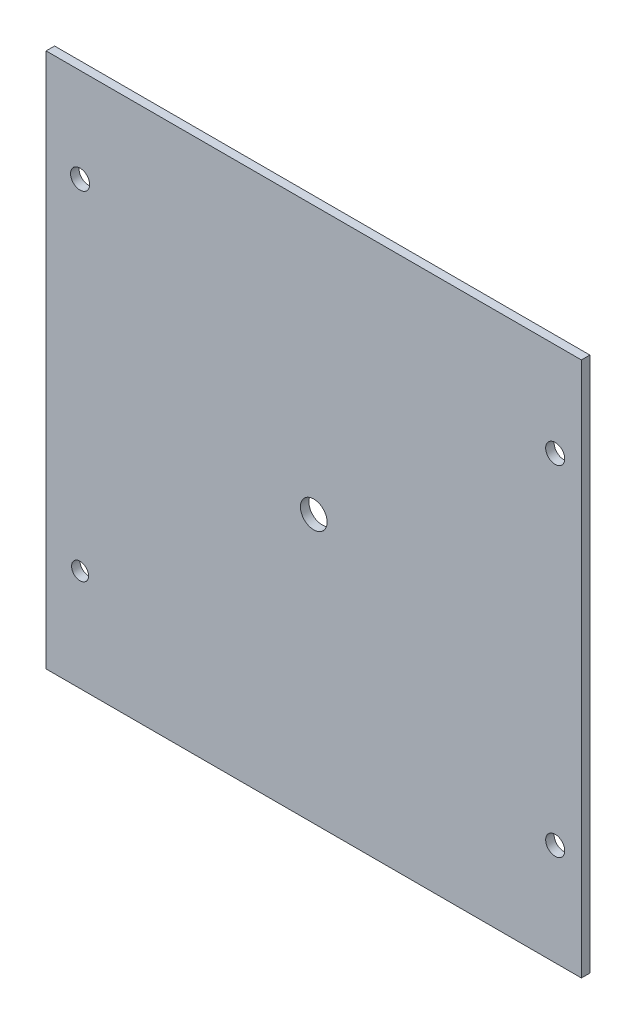
ISO-10303-21;
HEADER;
FILE_DESCRIPTION(('STEP AP214'),'2;1');
FILE_NAME('part.step','',(''),(''),'','','');
FILE_SCHEMA(('AUTOMOTIVE_DESIGN { 1 0 10303 214 1 1 1 1 }'));
ENDSEC;
DATA;
#1=APPLICATION_CONTEXT('core data for automotive mechanical design processes');
#2=APPLICATION_PROTOCOL_DEFINITION('international standard','automotive_design',2000,#1);
#3=PRODUCT_CONTEXT('',#1,'mechanical');
#4=PRODUCT('Part','Part','',(#3));
#5=PRODUCT_RELATED_PRODUCT_CATEGORY('part','',(#4));
#6=PRODUCT_DEFINITION_FORMATION('','',#4);
#7=PRODUCT_DEFINITION_CONTEXT('part definition',#1,'design');
#8=PRODUCT_DEFINITION('design','',#6,#7);
#9=PRODUCT_DEFINITION_SHAPE('','',#8);
#10=(LENGTH_UNIT() NAMED_UNIT(*) SI_UNIT(.MILLI.,.METRE.));
#11=(NAMED_UNIT(*) PLANE_ANGLE_UNIT() SI_UNIT($,.RADIAN.));
#12=(NAMED_UNIT(*) SI_UNIT($,.STERADIAN.) SOLID_ANGLE_UNIT());
#13=UNCERTAINTY_MEASURE_WITH_UNIT(LENGTH_MEASURE(1.E-05),#10,'distance_accuracy_value','');
#14=(GEOMETRIC_REPRESENTATION_CONTEXT(3) GLOBAL_UNCERTAINTY_ASSIGNED_CONTEXT((#13)) GLOBAL_UNIT_ASSIGNED_CONTEXT((#10,
#11,#12)) REPRESENTATION_CONTEXT('',''));
#15=CARTESIAN_POINT('',(0.,0.,0.));
#16=DIRECTION('',(0.,0.,1.));
#17=DIRECTION('',(1.,0.,0.));
#18=AXIS2_PLACEMENT_3D('',#15,#16,#17);
#19=CARTESIAN_POINT('',(0.,0.,3.175));
#20=DIRECTION('',(0.,0.,-1.));
#21=DIRECTION('',(-1.,0.,0.));
#22=AXIS2_PLACEMENT_3D('',#19,#20,#21);
#23=PLANE('',#22);
#24=DIRECTION('',(0.,-1.,0.));
#25=VECTOR('',#24,1.);
#26=CARTESIAN_POINT('',(0.,0.,3.175));
#27=LINE('',#26,#25);
#28=CARTESIAN_POINT('',(0.,200.3,3.175));
#29=VERTEX_POINT('',#28);
#30=CARTESIAN_POINT('',(0.,0.,3.175));
#31=VERTEX_POINT('',#30);
#32=EDGE_CURVE('E85',#29,#31,#27,.T.);
#33=ORIENTED_EDGE('',*,*,#32,.T.);
#34=DIRECTION('',(1.,0.,0.));
#35=VECTOR('',#34,1.);
#36=CARTESIAN_POINT('',(0.,0.,3.175));
#37=LINE('',#36,#35);
#38=CARTESIAN_POINT('',(200.3,0.,3.175));
#39=VERTEX_POINT('',#38);
#40=EDGE_CURVE('E80',#31,#39,#37,.T.);
#41=ORIENTED_EDGE('',*,*,#40,.T.);
#42=DIRECTION('',(0.,1.,0.));
#43=VECTOR('',#42,1.);
#44=CARTESIAN_POINT('',(200.3,0.,3.175));
#45=LINE('',#44,#43);
#46=CARTESIAN_POINT('',(200.3,200.3,3.175));
#47=VERTEX_POINT('',#46);
#48=EDGE_CURVE('E83',#39,#47,#45,.T.);
#49=ORIENTED_EDGE('',*,*,#48,.T.);
#50=DIRECTION('',(-1.,0.,0.));
#51=VECTOR('',#50,1.);
#52=CARTESIAN_POINT('',(0.,200.3,3.175));
#53=LINE('',#52,#51);
#54=EDGE_CURVE('E50',#47,#29,#53,.T.);
#55=ORIENTED_EDGE('',*,*,#54,.T.);
#56=EDGE_LOOP('',(#33,#41,#49,#55));
#57=FACE_BOUND('',#56,.T.);
#58=CARTESIAN_POINT('',(12.7,38.1,3.175));
#59=DIRECTION('',(0.,0.,1.));
#60=DIRECTION('',(1.,0.,0.));
#61=AXIS2_PLACEMENT_3D('',#58,#59,#60);
#62=CIRCLE('',#61,3.175);
#63=CARTESIAN_POINT('',(15.875,38.1,3.175));
#64=VERTEX_POINT('',#63);
#65=EDGE_CURVE('E100',#64,#64,#62,.T.);
#66=ORIENTED_EDGE('',*,*,#65,.F.);
#67=EDGE_LOOP('',(#66));
#68=FACE_BOUND('',#67,.T.);
#69=CARTESIAN_POINT('',(12.7,165.1,3.175));
#70=DIRECTION('',(0.,0.,1.));
#71=DIRECTION('',(1.,0.,0.));
#72=AXIS2_PLACEMENT_3D('',#69,#70,#71);
#73=CIRCLE('',#72,3.57);
#74=CARTESIAN_POINT('',(16.27,165.1,3.175));
#75=VERTEX_POINT('',#74);
#76=EDGE_CURVE('E115',#75,#75,#73,.T.);
#77=ORIENTED_EDGE('',*,*,#76,.F.);
#78=EDGE_LOOP('',(#77));
#79=FACE_BOUND('',#78,.T.);
#80=CARTESIAN_POINT('',(190.5,165.1,3.175));
#81=DIRECTION('',(0.,0.,1.));
#82=DIRECTION('',(1.,0.,0.));
#83=AXIS2_PLACEMENT_3D('',#80,#81,#82);
#84=CIRCLE('',#83,3.56999999999998);
#85=CARTESIAN_POINT('',(194.07,165.1,3.175));
#86=VERTEX_POINT('',#85);
#87=EDGE_CURVE('E121',#86,#86,#84,.T.);
#88=ORIENTED_EDGE('',*,*,#87,.F.);
#89=EDGE_LOOP('',(#88));
#90=FACE_BOUND('',#89,.T.);
#91=CARTESIAN_POINT('',(190.5,38.1,3.175));
#92=DIRECTION('',(0.,0.,1.));
#93=DIRECTION('',(1.,0.,0.));
#94=AXIS2_PLACEMENT_3D('',#91,#92,#93);
#95=CIRCLE('',#94,3.57000000000001);
#96=CARTESIAN_POINT('',(194.07,38.1,3.175));
#97=VERTEX_POINT('',#96);
#98=EDGE_CURVE('E127',#97,#97,#95,.T.);
#99=ORIENTED_EDGE('',*,*,#98,.F.);
#100=EDGE_LOOP('',(#99));
#101=FACE_BOUND('',#100,.T.);
#102=CARTESIAN_POINT('',(100.15,100.15,3.175));
#103=DIRECTION('',(0.,0.,1.));
#104=DIRECTION('',(1.,0.,0.));
#105=AXIS2_PLACEMENT_3D('',#102,#103,#104);
#106=CIRCLE('',#105,5.00000000000001);
#107=CARTESIAN_POINT('',(105.15,100.15,3.175));
#108=VERTEX_POINT('',#107);
#109=EDGE_CURVE('E133',#108,#108,#106,.T.);
#110=ORIENTED_EDGE('',*,*,#109,.F.);
#111=EDGE_LOOP('',(#110));
#112=FACE_BOUND('',#111,.T.);
#113=ADVANCED_FACE('F33',(#57,#68,#79,#90,#101,#112),#23,.F.);
#114=CARTESIAN_POINT('',(0.,0.,0.));
#115=DIRECTION('',(0.,0.,-1.));
#116=DIRECTION('',(-1.,0.,0.));
#117=AXIS2_PLACEMENT_3D('',#114,#115,#116);
#118=PLANE('',#117);
#119=CARTESIAN_POINT('',(190.5,38.1,0.));
#120=DIRECTION('',(0.,0.,1.));
#121=DIRECTION('',(1.,0.,0.));
#122=AXIS2_PLACEMENT_3D('',#119,#120,#121);
#123=CIRCLE('',#122,3.57000000000001);
#124=CARTESIAN_POINT('',(194.07,38.1,0.));
#125=VERTEX_POINT('',#124);
#126=EDGE_CURVE('E130',#125,#125,#123,.T.);
#127=ORIENTED_EDGE('',*,*,#126,.T.);
#128=EDGE_LOOP('',(#127));
#129=FACE_BOUND('',#128,.T.);
#130=CARTESIAN_POINT('',(12.7,165.1,0.));
#131=DIRECTION('',(0.,0.,1.));
#132=DIRECTION('',(1.,0.,0.));
#133=AXIS2_PLACEMENT_3D('',#130,#131,#132);
#134=CIRCLE('',#133,3.57);
#135=CARTESIAN_POINT('',(16.27,165.1,0.));
#136=VERTEX_POINT('',#135);
#137=EDGE_CURVE('E118',#136,#136,#134,.T.);
#138=ORIENTED_EDGE('',*,*,#137,.T.);
#139=EDGE_LOOP('',(#138));
#140=FACE_BOUND('',#139,.T.);
#141=DIRECTION('',(0.,-1.,0.));
#142=VECTOR('',#141,1.);
#143=CARTESIAN_POINT('',(0.,0.,0.));
#144=LINE('',#143,#142);
#145=CARTESIAN_POINT('',(0.,200.3,0.));
#146=VERTEX_POINT('',#145);
#147=CARTESIAN_POINT('',(0.,0.,0.));
#148=VERTEX_POINT('',#147);
#149=EDGE_CURVE('E97',#146,#148,#144,.T.);
#150=ORIENTED_EDGE('',*,*,#149,.F.);
#151=DIRECTION('',(-1.,0.,0.));
#152=VECTOR('',#151,1.);
#153=CARTESIAN_POINT('',(0.,200.3,0.));
#154=LINE('',#153,#152);
#155=CARTESIAN_POINT('',(200.3,200.3,0.));
#156=VERTEX_POINT('',#155);
#157=EDGE_CURVE('E73',#156,#146,#154,.T.);
#158=ORIENTED_EDGE('',*,*,#157,.F.);
#159=DIRECTION('',(0.,1.,0.));
#160=VECTOR('',#159,1.);
#161=CARTESIAN_POINT('',(200.3,0.,0.));
#162=LINE('',#161,#160);
#163=CARTESIAN_POINT('',(200.3,0.,0.));
#164=VERTEX_POINT('',#163);
#165=EDGE_CURVE('E67',#164,#156,#162,.T.);
#166=ORIENTED_EDGE('',*,*,#165,.F.);
#167=DIRECTION('',(1.,0.,0.));
#168=VECTOR('',#167,1.);
#169=CARTESIAN_POINT('',(0.,0.,0.));
#170=LINE('',#169,#168);
#171=EDGE_CURVE('E89',#148,#164,#170,.T.);
#172=ORIENTED_EDGE('',*,*,#171,.F.);
#173=EDGE_LOOP('',(#150,#158,#166,#172));
#174=FACE_BOUND('',#173,.T.);
#175=CARTESIAN_POINT('',(12.7,38.1,0.));
#176=DIRECTION('',(0.,0.,1.));
#177=DIRECTION('',(1.,0.,0.));
#178=AXIS2_PLACEMENT_3D('',#175,#176,#177);
#179=CIRCLE('',#178,3.175);
#180=CARTESIAN_POINT('',(15.875,38.1,0.));
#181=VERTEX_POINT('',#180);
#182=EDGE_CURVE('E112',#181,#181,#179,.T.);
#183=ORIENTED_EDGE('',*,*,#182,.T.);
#184=EDGE_LOOP('',(#183));
#185=FACE_BOUND('',#184,.T.);
#186=CARTESIAN_POINT('',(190.5,165.1,0.));
#187=DIRECTION('',(0.,0.,1.));
#188=DIRECTION('',(1.,0.,0.));
#189=AXIS2_PLACEMENT_3D('',#186,#187,#188);
#190=CIRCLE('',#189,3.56999999999998);
#191=CARTESIAN_POINT('',(194.07,165.1,0.));
#192=VERTEX_POINT('',#191);
#193=EDGE_CURVE('E124',#192,#192,#190,.T.);
#194=ORIENTED_EDGE('',*,*,#193,.T.);
#195=EDGE_LOOP('',(#194));
#196=FACE_BOUND('',#195,.T.);
#197=CARTESIAN_POINT('',(100.15,100.15,0.));
#198=DIRECTION('',(0.,0.,1.));
#199=DIRECTION('',(1.,0.,0.));
#200=AXIS2_PLACEMENT_3D('',#197,#198,#199);
#201=CIRCLE('',#200,5.00000000000001);
#202=CARTESIAN_POINT('',(105.15,100.15,0.));
#203=VERTEX_POINT('',#202);
#204=EDGE_CURVE('E136',#203,#203,#201,.T.);
#205=ORIENTED_EDGE('',*,*,#204,.T.);
#206=EDGE_LOOP('',(#205));
#207=FACE_BOUND('',#206,.T.);
#208=ADVANCED_FACE('F108',(#129,#140,#174,#185,#196,#207),#118,.T.);
#209=CARTESIAN_POINT('',(0.,0.,3.175));
#210=DIRECTION('',(1.,0.,0.));
#211=DIRECTION('',(0.,0.,-1.));
#212=AXIS2_PLACEMENT_3D('',#209,#210,#211);
#213=PLANE('',#212);
#214=ORIENTED_EDGE('',*,*,#149,.T.);
#215=DIRECTION('',(0.,0.,-1.));
#216=VECTOR('',#215,1.);
#217=CARTESIAN_POINT('',(0.,0.,3.175));
#218=LINE('',#217,#216);
#219=EDGE_CURVE('E11',#31,#148,#218,.T.);
#220=ORIENTED_EDGE('',*,*,#219,.F.);
#221=ORIENTED_EDGE('',*,*,#32,.F.);
#222=DIRECTION('',(0.,0.,-1.));
#223=VECTOR('',#222,1.);
#224=CARTESIAN_POINT('',(0.,200.3,3.175));
#225=LINE('',#224,#223);
#226=EDGE_CURVE('E93',#29,#146,#225,.T.);
#227=ORIENTED_EDGE('',*,*,#226,.T.);
#228=EDGE_LOOP('',(#214,#220,#221,#227));
#229=FACE_BOUND('',#228,.T.);
#230=ADVANCED_FACE('F35',(#229),#213,.F.);
#231=CARTESIAN_POINT('',(0.,0.,3.175));
#232=DIRECTION('',(0.,1.,0.));
#233=DIRECTION('',(0.,0.,1.));
#234=AXIS2_PLACEMENT_3D('',#231,#232,#233);
#235=PLANE('',#234);
#236=ORIENTED_EDGE('',*,*,#171,.T.);
#237=DIRECTION('',(0.,0.,-1.));
#238=VECTOR('',#237,1.);
#239=CARTESIAN_POINT('',(200.3,0.,3.175));
#240=LINE('',#239,#238);
#241=EDGE_CURVE('E42',#39,#164,#240,.T.);
#242=ORIENTED_EDGE('',*,*,#241,.F.);
#243=ORIENTED_EDGE('',*,*,#40,.F.);
#244=ORIENTED_EDGE('',*,*,#219,.T.);
#245=EDGE_LOOP('',(#236,#242,#243,#244));
#246=FACE_BOUND('',#245,.T.);
#247=ADVANCED_FACE('F88',(#246),#235,.F.);
#248=CARTESIAN_POINT('',(200.3,0.,3.175));
#249=DIRECTION('',(-1.,0.,0.));
#250=DIRECTION('',(0.,0.,1.));
#251=AXIS2_PLACEMENT_3D('',#248,#249,#250);
#252=PLANE('',#251);
#253=ORIENTED_EDGE('',*,*,#165,.T.);
#254=DIRECTION('',(0.,0.,-1.));
#255=VECTOR('',#254,1.);
#256=CARTESIAN_POINT('',(200.3,200.3,3.175));
#257=LINE('',#256,#255);
#258=EDGE_CURVE('E90',#47,#156,#257,.T.);
#259=ORIENTED_EDGE('',*,*,#258,.F.);
#260=ORIENTED_EDGE('',*,*,#48,.F.);
#261=ORIENTED_EDGE('',*,*,#241,.T.);
#262=EDGE_LOOP('',(#253,#259,#260,#261));
#263=FACE_BOUND('',#262,.T.);
#264=ADVANCED_FACE('F91',(#263),#252,.F.);
#265=CARTESIAN_POINT('',(0.,200.3,3.175));
#266=DIRECTION('',(0.,-1.,0.));
#267=DIRECTION('',(0.,0.,-1.));
#268=AXIS2_PLACEMENT_3D('',#265,#266,#267);
#269=PLANE('',#268);
#270=ORIENTED_EDGE('',*,*,#157,.T.);
#271=ORIENTED_EDGE('',*,*,#226,.F.);
#272=ORIENTED_EDGE('',*,*,#54,.F.);
#273=ORIENTED_EDGE('',*,*,#258,.T.);
#274=EDGE_LOOP('',(#270,#271,#272,#273));
#275=FACE_BOUND('',#274,.T.);
#276=ADVANCED_FACE('F105',(#275),#269,.F.);
#277=CARTESIAN_POINT('',(12.7,38.1,3.175));
#278=DIRECTION('',(0.,0.,-1.));
#279=DIRECTION('',(-1.,0.,0.));
#280=AXIS2_PLACEMENT_3D('',#277,#278,#279);
#281=CYLINDRICAL_SURFACE('',#280,3.175);
#282=ORIENTED_EDGE('',*,*,#65,.T.);
#283=EDGE_LOOP('',(#282));
#284=FACE_BOUND('',#283,.T.);
#285=ORIENTED_EDGE('',*,*,#182,.F.);
#286=EDGE_LOOP('',(#285));
#287=FACE_BOUND('',#286,.T.);
#288=ADVANCED_FACE('F153',(#284,#287),#281,.F.);
#289=CARTESIAN_POINT('',(12.7,165.1,3.175));
#290=DIRECTION('',(0.,0.,-1.));
#291=DIRECTION('',(-1.,0.,0.));
#292=AXIS2_PLACEMENT_3D('',#289,#290,#291);
#293=CYLINDRICAL_SURFACE('',#292,3.57);
#294=ORIENTED_EDGE('',*,*,#76,.T.);
#295=EDGE_LOOP('',(#294));
#296=FACE_BOUND('',#295,.T.);
#297=ORIENTED_EDGE('',*,*,#137,.F.);
#298=EDGE_LOOP('',(#297));
#299=FACE_BOUND('',#298,.T.);
#300=ADVANCED_FACE('F199',(#296,#299),#293,.F.);
#301=CARTESIAN_POINT('',(190.5,165.1,3.175));
#302=DIRECTION('',(0.,0.,-1.));
#303=DIRECTION('',(-1.,0.,0.));
#304=AXIS2_PLACEMENT_3D('',#301,#302,#303);
#305=CYLINDRICAL_SURFACE('',#304,3.56999999999998);
#306=ORIENTED_EDGE('',*,*,#87,.T.);
#307=EDGE_LOOP('',(#306));
#308=FACE_BOUND('',#307,.T.);
#309=ORIENTED_EDGE('',*,*,#193,.F.);
#310=EDGE_LOOP('',(#309));
#311=FACE_BOUND('',#310,.T.);
#312=ADVANCED_FACE('F207',(#308,#311),#305,.F.);
#313=CARTESIAN_POINT('',(190.5,38.1,3.175));
#314=DIRECTION('',(0.,0.,-1.));
#315=DIRECTION('',(-1.,0.,0.));
#316=AXIS2_PLACEMENT_3D('',#313,#314,#315);
#317=CYLINDRICAL_SURFACE('',#316,3.57000000000001);
#318=ORIENTED_EDGE('',*,*,#98,.T.);
#319=EDGE_LOOP('',(#318));
#320=FACE_BOUND('',#319,.T.);
#321=ORIENTED_EDGE('',*,*,#126,.F.);
#322=EDGE_LOOP('',(#321));
#323=FACE_BOUND('',#322,.T.);
#324=ADVANCED_FACE('F215',(#320,#323),#317,.F.);
#325=CARTESIAN_POINT('',(100.15,100.15,3.175));
#326=DIRECTION('',(0.,0.,-1.));
#327=DIRECTION('',(-1.,0.,0.));
#328=AXIS2_PLACEMENT_3D('',#325,#326,#327);
#329=CYLINDRICAL_SURFACE('',#328,5.00000000000001);
#330=ORIENTED_EDGE('',*,*,#109,.T.);
#331=EDGE_LOOP('',(#330));
#332=FACE_BOUND('',#331,.T.);
#333=ORIENTED_EDGE('',*,*,#204,.F.);
#334=EDGE_LOOP('',(#333));
#335=FACE_BOUND('',#334,.T.);
#336=ADVANCED_FACE('F142',(#332,#335),#329,.F.);
#337=CLOSED_SHELL('',(#113,#208,#230,#247,#264,#276,#288,#300,#312,#324,#336));
#338=MANIFOLD_SOLID_BREP('B2',#337);
#339=ADVANCED_BREP_SHAPE_REPRESENTATION('',(#18,#338),#14);
#340=SHAPE_DEFINITION_REPRESENTATION(#9,#339);
ENDSEC;
END-ISO-10303-21;
